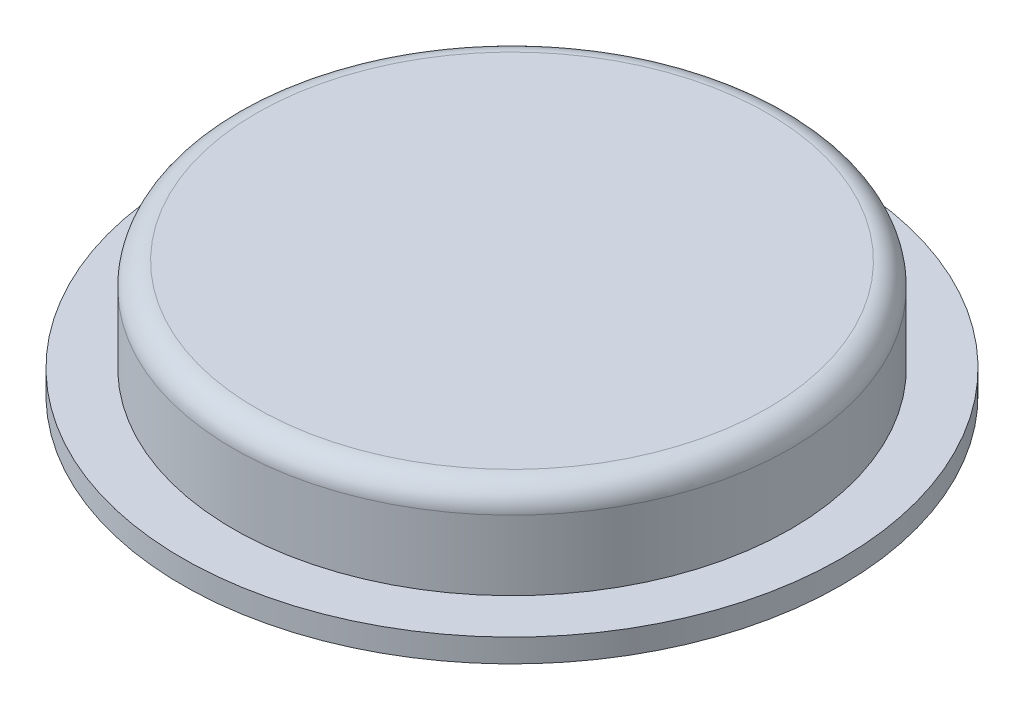
ISO-10303-21;
HEADER;
FILE_DESCRIPTION(('STEP AP214'),'2;1');
FILE_NAME('part.step','',(''),(''),'','','');
FILE_SCHEMA(('AUTOMOTIVE_DESIGN { 1 0 10303 214 1 1 1 1 }'));
ENDSEC;
DATA;
#1=APPLICATION_CONTEXT('core data for automotive mechanical design processes');
#2=APPLICATION_PROTOCOL_DEFINITION('international standard','automotive_design',2000,#1);
#3=PRODUCT_CONTEXT('',#1,'mechanical');
#4=PRODUCT('Part','Part','',(#3));
#5=PRODUCT_RELATED_PRODUCT_CATEGORY('part','',(#4));
#6=PRODUCT_DEFINITION_FORMATION('','',#4);
#7=PRODUCT_DEFINITION_CONTEXT('part definition',#1,'design');
#8=PRODUCT_DEFINITION('design','',#6,#7);
#9=PRODUCT_DEFINITION_SHAPE('','',#8);
#10=(LENGTH_UNIT() NAMED_UNIT(*) SI_UNIT(.MILLI.,.METRE.));
#11=(NAMED_UNIT(*) PLANE_ANGLE_UNIT() SI_UNIT($,.RADIAN.));
#12=(NAMED_UNIT(*) SI_UNIT($,.STERADIAN.) SOLID_ANGLE_UNIT());
#13=UNCERTAINTY_MEASURE_WITH_UNIT(LENGTH_MEASURE(1.E-05),#10,'distance_accuracy_value','');
#14=(GEOMETRIC_REPRESENTATION_CONTEXT(3) GLOBAL_UNCERTAINTY_ASSIGNED_CONTEXT((#13)) GLOBAL_UNIT_ASSIGNED_CONTEXT((#10,
#11,#12)) REPRESENTATION_CONTEXT('',''));
#15=CARTESIAN_POINT('',(0.,0.,0.));
#16=DIRECTION('',(0.,0.,1.));
#17=DIRECTION('',(1.,0.,0.));
#18=AXIS2_PLACEMENT_3D('',#15,#16,#17);
#19=CARTESIAN_POINT('',(0.,2.5,0.));
#20=DIRECTION('',(0.,1.,0.));
#21=DIRECTION('',(-1.,0.,0.));
#22=AXIS2_PLACEMENT_3D('',#19,#20,#21);
#23=CYLINDRICAL_SURFACE('',#22,7.09180327868852);
#24=CARTESIAN_POINT('',(0.,0.,0.));
#25=DIRECTION('',(0.,1.,0.));
#26=DIRECTION('',(-1.,0.,0.));
#27=AXIS2_PLACEMENT_3D('',#24,#25,#26);
#28=CIRCLE('',#27,7.09180327868852);
#29=CARTESIAN_POINT('',(-7.09180327868852,0.,0.));
#30=VERTEX_POINT('',#29);
#31=EDGE_CURVE('E60',#30,#30,#28,.T.);
#32=ORIENTED_EDGE('',*,*,#31,.T.);
#33=EDGE_LOOP('',(#32));
#34=FACE_BOUND('',#33,.T.);
#35=CARTESIAN_POINT('',(0.,0.5,0.));
#36=DIRECTION('',(0.,1.,0.));
#37=DIRECTION('',(-1.,0.,0.));
#38=AXIS2_PLACEMENT_3D('',#35,#36,#37);
#39=CIRCLE('',#38,7.09180327868852);
#40=CARTESIAN_POINT('',(-7.09180327868852,0.5,0.));
#41=VERTEX_POINT('',#40);
#42=EDGE_CURVE('E45',#41,#41,#39,.T.);
#43=ORIENTED_EDGE('',*,*,#42,.F.);
#44=EDGE_LOOP('',(#43));
#45=FACE_BOUND('',#44,.T.);
#46=ADVANCED_FACE('F34',(#34,#45),#23,.T.);
#47=CARTESIAN_POINT('',(-7.09180327868852,0.5,0.));
#48=DIRECTION('',(0.,1.,0.));
#49=DIRECTION('',(-1.,0.,0.));
#50=AXIS2_PLACEMENT_3D('',#47,#48,#49);
#51=PLANE('',#50);
#52=ORIENTED_EDGE('',*,*,#42,.T.);
#53=EDGE_LOOP('',(#52));
#54=FACE_BOUND('',#53,.T.);
#55=CARTESIAN_POINT('',(0.,0.5,0.));
#56=DIRECTION('',(0.,1.,0.));
#57=DIRECTION('',(-1.,0.,0.));
#58=AXIS2_PLACEMENT_3D('',#55,#56,#57);
#59=CIRCLE('',#58,6.);
#60=CARTESIAN_POINT('',(-6.,0.5,0.));
#61=VERTEX_POINT('',#60);
#62=EDGE_CURVE('E49',#61,#61,#59,.T.);
#63=ORIENTED_EDGE('',*,*,#62,.F.);
#64=EDGE_LOOP('',(#63));
#65=FACE_BOUND('',#64,.T.);
#66=ADVANCED_FACE('F80',(#54,#65),#51,.T.);
#67=CARTESIAN_POINT('',(0.,2.5,0.));
#68=DIRECTION('',(0.,1.,0.));
#69=DIRECTION('',(-1.,0.,0.));
#70=AXIS2_PLACEMENT_3D('',#67,#68,#69);
#71=CYLINDRICAL_SURFACE('',#70,6.);
#72=CARTESIAN_POINT('',(0.,2.,0.));
#73=DIRECTION('',(0.,1.,0.));
#74=DIRECTION('',(-1.,0.,0.));
#75=AXIS2_PLACEMENT_3D('',#72,#73,#74);
#76=CIRCLE('',#75,6.);
#77=CARTESIAN_POINT('',(-6.,2.,0.));
#78=VERTEX_POINT('',#77);
#79=EDGE_CURVE('E10',#78,#78,#76,.F.);
#80=ORIENTED_EDGE('',*,*,#79,.T.);
#81=EDGE_LOOP('',(#80));
#82=FACE_BOUND('',#81,.T.);
#83=ORIENTED_EDGE('',*,*,#62,.T.);
#84=EDGE_LOOP('',(#83));
#85=FACE_BOUND('',#84,.T.);
#86=ADVANCED_FACE('F84',(#82,#85),#71,.T.);
#87=CARTESIAN_POINT('',(-6.,2.5,0.));
#88=DIRECTION('',(0.,1.,0.));
#89=DIRECTION('',(-1.,0.,0.));
#90=AXIS2_PLACEMENT_3D('',#87,#88,#89);
#91=PLANE('',#90);
#92=CARTESIAN_POINT('',(0.,2.5,0.));
#93=DIRECTION('',(0.,1.,0.));
#94=DIRECTION('',(-1.,0.,0.));
#95=AXIS2_PLACEMENT_3D('',#92,#93,#94);
#96=CIRCLE('',#95,5.5);
#97=CARTESIAN_POINT('',(-5.5,2.5,0.));
#98=VERTEX_POINT('',#97);
#99=EDGE_CURVE('E41',#98,#98,#96,.T.);
#100=ORIENTED_EDGE('',*,*,#99,.T.);
#101=EDGE_LOOP('',(#100));
#102=FACE_BOUND('',#101,.T.);
#103=ADVANCED_FACE('F90',(#102),#91,.T.);
#104=CARTESIAN_POINT('',(0.,1.34059924208361,0.));
#105=DIRECTION('',(0.,-1.,0.));
#106=DIRECTION('',(1.,0.,0.));
#107=AXIS2_PLACEMENT_3D('',#104,#105,#106);
#108=PLANE('',#107);
#109=CARTESIAN_POINT('',(0.,1.34059924208361,0.));
#110=DIRECTION('',(0.,1.,0.));
#111=DIRECTION('',(-1.,0.,0.));
#112=AXIS2_PLACEMENT_3D('',#109,#110,#111);
#113=CIRCLE('',#112,5.29596385570328);
#114=CARTESIAN_POINT('',(-5.29596385570328,1.34059924208361,0.));
#115=VERTEX_POINT('',#114);
#116=EDGE_CURVE('E54',#115,#115,#113,.T.);
#117=ORIENTED_EDGE('',*,*,#116,.F.);
#118=EDGE_LOOP('',(#117));
#119=FACE_BOUND('',#118,.T.);
#120=ADVANCED_FACE('F76',(#119),#108,.T.);
#121=CARTESIAN_POINT('',(0.,2.5,0.));
#122=DIRECTION('',(0.,1.,0.));
#123=DIRECTION('',(-1.,0.,0.));
#124=AXIS2_PLACEMENT_3D('',#121,#122,#123);
#125=CYLINDRICAL_SURFACE('',#124,5.29596385570328);
#126=ORIENTED_EDGE('',*,*,#116,.T.);
#127=EDGE_LOOP('',(#126));
#128=FACE_BOUND('',#127,.T.);
#129=CARTESIAN_POINT('',(0.,0.,0.));
#130=DIRECTION('',(0.,1.,0.));
#131=DIRECTION('',(-1.,0.,0.));
#132=AXIS2_PLACEMENT_3D('',#129,#130,#131);
#133=CIRCLE('',#132,5.29596385570328);
#134=CARTESIAN_POINT('',(-5.29596385570328,0.,0.));
#135=VERTEX_POINT('',#134);
#136=EDGE_CURVE('E57',#135,#135,#133,.T.);
#137=ORIENTED_EDGE('',*,*,#136,.F.);
#138=EDGE_LOOP('',(#137));
#139=FACE_BOUND('',#138,.T.);
#140=ADVANCED_FACE('F68',(#128,#139),#125,.F.);
#141=CARTESIAN_POINT('',(-5.29596385570328,0.,0.));
#142=DIRECTION('',(0.,-1.,0.));
#143=DIRECTION('',(1.,0.,0.));
#144=AXIS2_PLACEMENT_3D('',#141,#142,#143);
#145=PLANE('',#144);
#146=ORIENTED_EDGE('',*,*,#136,.T.);
#147=EDGE_LOOP('',(#146));
#148=FACE_BOUND('',#147,.T.);
#149=ORIENTED_EDGE('',*,*,#31,.F.);
#150=EDGE_LOOP('',(#149));
#151=FACE_BOUND('',#150,.T.);
#152=ADVANCED_FACE('F66',(#148,#151),#145,.T.);
#153=CARTESIAN_POINT('',(0.,2.,0.));
#154=DIRECTION('',(0.,1.,0.));
#155=DIRECTION('',(-1.,0.,0.));
#156=AXIS2_PLACEMENT_3D('',#153,#154,#155);
#157=TOROIDAL_SURFACE('',#156,5.5,0.5);
#158=ORIENTED_EDGE('',*,*,#79,.F.);
#159=EDGE_LOOP('',(#158));
#160=FACE_BOUND('',#159,.T.);
#161=ORIENTED_EDGE('',*,*,#99,.F.);
#162=EDGE_LOOP('',(#161));
#163=FACE_BOUND('',#162,.T.);
#164=ADVANCED_FACE('F36',(#160,#163),#157,.T.);
#165=CLOSED_SHELL('',(#46,#66,#86,#103,#120,#140,#152,#164));
#166=MANIFOLD_SOLID_BREP('B2',#165);
#167=ADVANCED_BREP_SHAPE_REPRESENTATION('',(#18,#166),#14);
#168=SHAPE_DEFINITION_REPRESENTATION(#9,#167);
ENDSEC;
END-ISO-10303-21;
